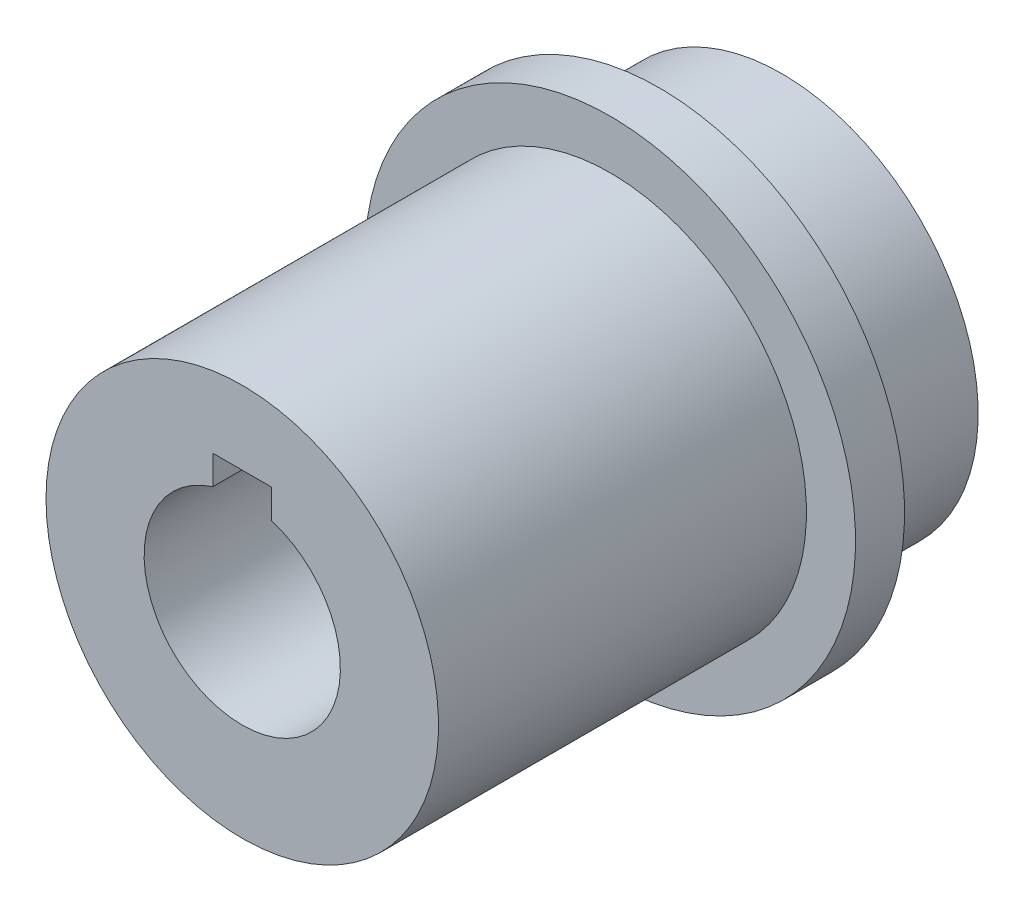
ISO-10303-21;
HEADER;
FILE_DESCRIPTION(('STEP AP214'),'2;1');
FILE_NAME('part.step','',(''),(''),'','','');
FILE_SCHEMA(('AUTOMOTIVE_DESIGN { 1 0 10303 214 1 1 1 1 }'));
ENDSEC;
DATA;
#1=APPLICATION_CONTEXT('core data for automotive mechanical design processes');
#2=APPLICATION_PROTOCOL_DEFINITION('international standard','automotive_design',2000,#1);
#3=PRODUCT_CONTEXT('',#1,'mechanical');
#4=PRODUCT('Part','Part','',(#3));
#5=PRODUCT_RELATED_PRODUCT_CATEGORY('part','',(#4));
#6=PRODUCT_DEFINITION_FORMATION('','',#4);
#7=PRODUCT_DEFINITION_CONTEXT('part definition',#1,'design');
#8=PRODUCT_DEFINITION('design','',#6,#7);
#9=PRODUCT_DEFINITION_SHAPE('','',#8);
#10=(LENGTH_UNIT() NAMED_UNIT(*) SI_UNIT(.MILLI.,.METRE.));
#11=(NAMED_UNIT(*) PLANE_ANGLE_UNIT() SI_UNIT($,.RADIAN.));
#12=(NAMED_UNIT(*) SI_UNIT($,.STERADIAN.) SOLID_ANGLE_UNIT());
#13=UNCERTAINTY_MEASURE_WITH_UNIT(LENGTH_MEASURE(1.E-05),#10,'distance_accuracy_value','');
#14=(GEOMETRIC_REPRESENTATION_CONTEXT(3) GLOBAL_UNCERTAINTY_ASSIGNED_CONTEXT((#13)) GLOBAL_UNIT_ASSIGNED_CONTEXT((#10,
#11,#12)) REPRESENTATION_CONTEXT('',''));
#15=CARTESIAN_POINT('',(0.,0.,0.));
#16=DIRECTION('',(0.,0.,1.));
#17=DIRECTION('',(1.,0.,0.));
#18=AXIS2_PLACEMENT_3D('',#15,#16,#17);
#19=CARTESIAN_POINT('',(0.,0.,109.999999999999));
#20=DIRECTION('',(0.,0.,-0.999999999999995));
#21=DIRECTION('',(-0.999999999999999,0.,0.));
#22=AXIS2_PLACEMENT_3D('',#19,#20,#21);
#23=CYLINDRICAL_SURFACE('',#22,40.);
#24=CARTESIAN_POINT('',(0.,0.,0.));
#25=DIRECTION('',(0.,0.,0.999999999999995));
#26=DIRECTION('',(0.999999999999999,0.,0.));
#27=AXIS2_PLACEMENT_3D('',#24,#25,#26);
#28=CIRCLE('',#27,40.);
#29=CARTESIAN_POINT('',(-40.,0.,0.));
#30=VERTEX_POINT('',#29);
#31=EDGE_CURVE('E117',#30,#30,#28,.T.);
#32=CARTESIAN_POINT('',(0.,0.,24.9999999999998));
#33=DIRECTION('',(0.,0.,0.999999999999995));
#34=DIRECTION('',(0.999999999999999,0.,0.));
#35=AXIS2_PLACEMENT_3D('',#32,#33,#34);
#36=CIRCLE('',#35,40.);
#37=CARTESIAN_POINT('',(-40.,0.,24.9999999999998));
#38=VERTEX_POINT('',#37);
#39=EDGE_CURVE('E109',#38,#38,#36,.T.);
#40=CARTESIAN_POINT('',(-40.,0.,0.));
#41=CARTESIAN_POINT('',(-40.,0.,0.260416666666652));
#42=CARTESIAN_POINT('',(-40.,0.,0.520833333333318));
#43=CARTESIAN_POINT('',(-40.,0.,1.04166666666665));
#44=CARTESIAN_POINT('',(-40.,0.,1.30208333333331));
#45=CARTESIAN_POINT('',(-40.,0.,1.82291666666664));
#46=CARTESIAN_POINT('',(-40.,0.,2.0833333333333));
#47=CARTESIAN_POINT('',(-40.,0.,2.60416666666663));
#48=CARTESIAN_POINT('',(-40.,0.,2.8645833333333));
#49=CARTESIAN_POINT('',(-40.,0.,3.38541666666663));
#50=CARTESIAN_POINT('',(-40.,0.,3.6458333333333));
#51=CARTESIAN_POINT('',(-40.,0.,4.16666666666663));
#52=CARTESIAN_POINT('',(-40.,0.,4.42708333333329));
#53=CARTESIAN_POINT('',(-40.,0.,4.94791666666662));
#54=CARTESIAN_POINT('',(-40.,0.,5.20833333333329));
#55=CARTESIAN_POINT('',(-40.,0.,5.72916666666662));
#56=CARTESIAN_POINT('',(-40.,0.,5.98958333333328));
#57=CARTESIAN_POINT('',(-40.,0.,6.51041666666662));
#58=CARTESIAN_POINT('',(-40.,0.,6.77083333333328));
#59=CARTESIAN_POINT('',(-40.,0.,7.29166666666661));
#60=CARTESIAN_POINT('',(-40.,0.,7.55208333333327));
#61=CARTESIAN_POINT('',(-40.,0.,8.0729166666666));
#62=CARTESIAN_POINT('',(-40.,0.,8.33333333333326));
#63=CARTESIAN_POINT('',(-40.,0.,8.8541666666666));
#64=CARTESIAN_POINT('',(-40.,0.,9.11458333333327));
#65=CARTESIAN_POINT('',(-40.,0.,9.6354166666666));
#66=CARTESIAN_POINT('',(-40.,0.,9.89583333333326));
#67=CARTESIAN_POINT('',(-40.,0.,10.4166666666666));
#68=CARTESIAN_POINT('',(-40.,0.,10.6770833333333));
#69=CARTESIAN_POINT('',(-40.,0.,11.1979166666666));
#70=CARTESIAN_POINT('',(-40.,0.,11.4583333333333));
#71=CARTESIAN_POINT('',(-40.,0.,11.9791666666666));
#72=CARTESIAN_POINT('',(-40.,0.,12.2395833333332));
#73=CARTESIAN_POINT('',(-40.,0.,12.7604166666666));
#74=CARTESIAN_POINT('',(-40.,0.,13.0208333333332));
#75=CARTESIAN_POINT('',(-40.,0.,13.5416666666666));
#76=CARTESIAN_POINT('',(-40.,0.,13.8020833333332));
#77=CARTESIAN_POINT('',(-40.,0.,14.3229166666666));
#78=CARTESIAN_POINT('',(-40.,0.,14.5833333333332));
#79=CARTESIAN_POINT('',(-40.,0.,15.1041666666666));
#80=CARTESIAN_POINT('',(-40.,0.,15.3645833333332));
#81=CARTESIAN_POINT('',(-40.,0.,15.8854166666665));
#82=CARTESIAN_POINT('',(-40.,0.,16.1458333333332));
#83=CARTESIAN_POINT('',(-40.,0.,16.6666666666666));
#84=CARTESIAN_POINT('',(-40.,0.,16.9270833333332));
#85=CARTESIAN_POINT('',(-40.,0.,17.4479166666665));
#86=CARTESIAN_POINT('',(-40.,0.,17.7083333333332));
#87=CARTESIAN_POINT('',(-40.,0.,18.2291666666665));
#88=CARTESIAN_POINT('',(-40.,0.,18.4895833333332));
#89=CARTESIAN_POINT('',(-40.,0.,19.0104166666665));
#90=CARTESIAN_POINT('',(-40.,0.,19.2708333333332));
#91=CARTESIAN_POINT('',(-40.,0.,19.7916666666665));
#92=CARTESIAN_POINT('',(-40.,0.,20.0520833333332));
#93=CARTESIAN_POINT('',(-40.,0.,20.5729166666665));
#94=CARTESIAN_POINT('',(-40.,0.,20.8333333333332));
#95=CARTESIAN_POINT('',(-40.,0.,21.3541666666665));
#96=CARTESIAN_POINT('',(-40.,0.,21.6145833333332));
#97=CARTESIAN_POINT('',(-40.,0.,22.1354166666665));
#98=CARTESIAN_POINT('',(-40.,0.,22.3958333333332));
#99=CARTESIAN_POINT('',(-40.,0.,22.9166666666665));
#100=CARTESIAN_POINT('',(-40.,0.,23.1770833333332));
#101=CARTESIAN_POINT('',(-40.,0.,23.6979166666665));
#102=CARTESIAN_POINT('',(-40.,0.,23.9583333333332));
#103=CARTESIAN_POINT('',(-40.,0.,24.4791666666665));
#104=CARTESIAN_POINT('',(-40.,0.,24.7395833333332));
#105=CARTESIAN_POINT('',(-40.,0.,24.9999999999998));
#106=B_SPLINE_CURVE_WITH_KNOTS('',3,(#40,#41,#42,#43,#44,#45,#46,#47,#48,#49,#50,#51,#52,#53,
#54,#55,#56,#57,#58,#59,#60,#61,#62,#63,#64,#65,#66,#67,#68,#69,#70,#71,#72,#73,#74,#75,#76,#77,
#78,#79,#80,#81,#82,#83,#84,#85,#86,#87,#88,#89,#90,#91,#92,#93,#94,#95,#96,#97,#98,#99,#100,
#101,#102,#103,#104,#105),.UNSPECIFIED.,.F.,.F.,(4,2,2,2,2,2,2,2,2,2,2,2,2,2,2,2,2,2,2,2,2,2,2,
2,2,2,2,2,2,2,2,2,4),(0.,0.781249999999997,1.56249999999999,2.34374999999998,3.12499999999998,
3.90624999999999,4.68749999999997,5.46874999999997,6.24999999999996,7.03124999999996,
7.81249999999994,8.59374999999994,9.37499999999995,10.1562499999999,10.9374999999999,
11.7187499999999,12.4999999999999,13.2812499999999,14.0624999999999,14.8437499999999,
15.6249999999999,16.4062499999999,17.1874999999999,17.9687499999999,18.7499999999999,
19.5312499999999,20.3124999999999,21.0937499999999,21.8749999999999,22.6562499999999,
23.4374999999998,24.2187499999998,24.9999999999998),.UNSPECIFIED.);
#107=EDGE_CURVE('BSEAM34',#30,#38,#106,.T.);
#108=ORIENTED_EDGE('',*,*,#31,.T.);
#109=ORIENTED_EDGE('',*,*,#39,.F.);
#110=ORIENTED_EDGE('',*,*,#107,.T.);
#111=ORIENTED_EDGE('',*,*,#107,.F.);
#112=EDGE_LOOP('',(#108,#110,#109,#111));
#113=FACE_BOUND('',#112,.T.);
#114=ADVANCED_FACE('F34',(#113),#23,.T.);
#115=CARTESIAN_POINT('',(0.,0.,109.999999999999));
#116=DIRECTION('',(0.,0.,0.999999999999995));
#117=DIRECTION('',(0.999999999999999,0.,0.));
#118=AXIS2_PLACEMENT_3D('',#115,#116,#117);
#119=PLANE('',#118);
#120=DIRECTION('',(0.,-0.999999999999999,0.));
#121=VECTOR('',#120,1.);
#122=CARTESIAN_POINT('',(6.00000000000001,24.9999999999999,109.999999999999));
#123=LINE('',#122,#121);
#124=CARTESIAN_POINT('',(6.00000000000001,24.9999999999999,109.999999999999));
#125=VERTEX_POINT('',#124);
#126=CARTESIAN_POINT('',(6.00000000000001,19.0787840283391,109.999999999999));
#127=VERTEX_POINT('',#126);
#128=EDGE_CURVE('E92',#125,#127,#123,.T.);
#129=ORIENTED_EDGE('',*,*,#128,.T.);
#130=CARTESIAN_POINT('',(0.,0.,109.999999999999));
#131=DIRECTION('',(0.,0.,0.999999999999995));
#132=DIRECTION('',(0.999999999999999,0.,0.));
#133=AXIS2_PLACEMENT_3D('',#130,#131,#132);
#134=CIRCLE('',#133,20.);
#135=CARTESIAN_POINT('',(-5.99999999999978,19.0787840283393,109.999999999999));
#136=VERTEX_POINT('',#135);
#137=EDGE_CURVE('E91',#136,#127,#134,.T.);
#138=ORIENTED_EDGE('',*,*,#137,.F.);
#139=DIRECTION('',(0.,0.999999999999997,0.));
#140=VECTOR('',#139,1.);
#141=CARTESIAN_POINT('',(-5.99999999999984,24.9999999999997,109.999999999999));
#142=LINE('',#141,#140);
#143=CARTESIAN_POINT('',(-5.99999999999984,24.9999999999997,109.999999999999));
#144=VERTEX_POINT('',#143);
#145=EDGE_CURVE('E49',#136,#144,#142,.T.);
#146=ORIENTED_EDGE('',*,*,#145,.T.);
#147=DIRECTION('',(0.999999999999999,0.,0.));
#148=VECTOR('',#147,1.);
#149=CARTESIAN_POINT('',(6.00000000000001,24.9999999999999,109.999999999999));
#150=LINE('',#149,#148);
#151=EDGE_CURVE('E81',#144,#125,#150,.T.);
#152=ORIENTED_EDGE('',*,*,#151,.T.);
#153=EDGE_LOOP('',(#129,#138,#146,#152));
#154=FACE_BOUND('',#153,.T.);
#155=CARTESIAN_POINT('',(0.,0.,109.999999999999));
#156=DIRECTION('',(0.,0.,0.999999999999995));
#157=DIRECTION('',(0.999999999999999,0.,0.));
#158=AXIS2_PLACEMENT_3D('',#155,#156,#157);
#159=CIRCLE('',#158,40.);
#160=CARTESIAN_POINT('',(-40.,0.,109.999999999999));
#161=VERTEX_POINT('',#160);
#162=EDGE_CURVE('E112',#161,#161,#159,.T.);
#163=ORIENTED_EDGE('',*,*,#162,.T.);
#164=EDGE_LOOP('',(#163));
#165=FACE_BOUND('',#164,.T.);
#166=ADVANCED_FACE('F88',(#154,#165),#119,.T.);
#167=CARTESIAN_POINT('',(0.,0.,0.));
#168=DIRECTION('',(0.,0.,0.999999999999995));
#169=DIRECTION('',(0.999999999999999,0.,0.));
#170=AXIS2_PLACEMENT_3D('',#167,#168,#169);
#171=PLANE('',#170);
#172=ORIENTED_EDGE('',*,*,#31,.F.);
#173=EDGE_LOOP('',(#172));
#174=FACE_BOUND('',#173,.T.);
#175=CARTESIAN_POINT('',(0.,0.,0.));
#176=DIRECTION('',(0.,0.,0.999999999999995));
#177=DIRECTION('',(0.999999999999999,0.,0.));
#178=AXIS2_PLACEMENT_3D('',#175,#176,#177);
#179=CIRCLE('',#178,20.);
#180=CARTESIAN_POINT('',(-5.99999999999978,19.0787840283393,0.));
#181=VERTEX_POINT('',#180);
#182=CARTESIAN_POINT('',(6.00000000000001,19.0787840283391,0.));
#183=VERTEX_POINT('',#182);
#184=EDGE_CURVE('E115',#181,#183,#179,.T.);
#185=ORIENTED_EDGE('',*,*,#184,.T.);
#186=DIRECTION('',(0.,-0.999999999999999,0.));
#187=VECTOR('',#186,1.);
#188=CARTESIAN_POINT('',(6.00000000000001,24.9999999999999,0.));
#189=LINE('',#188,#187);
#190=CARTESIAN_POINT('',(6.00000000000001,24.9999999999999,0.));
#191=VERTEX_POINT('',#190);
#192=EDGE_CURVE('E97',#191,#183,#189,.T.);
#193=ORIENTED_EDGE('',*,*,#192,.F.);
#194=DIRECTION('',(0.999999999999999,0.,0.));
#195=VECTOR('',#194,1.);
#196=CARTESIAN_POINT('',(6.00000000000001,24.9999999999999,0.));
#197=LINE('',#196,#195);
#198=CARTESIAN_POINT('',(-5.99999999999984,24.9999999999997,0.));
#199=VERTEX_POINT('',#198);
#200=EDGE_CURVE('E94',#199,#191,#197,.T.);
#201=ORIENTED_EDGE('',*,*,#200,.F.);
#202=DIRECTION('',(0.,0.999999999999997,0.));
#203=VECTOR('',#202,1.);
#204=CARTESIAN_POINT('',(-5.99999999999984,24.9999999999997,0.));
#205=LINE('',#204,#203);
#206=EDGE_CURVE('E76',#181,#199,#205,.T.);
#207=ORIENTED_EDGE('',*,*,#206,.F.);
#208=EDGE_LOOP('',(#185,#193,#201,#207));
#209=FACE_BOUND('',#208,.T.);
#210=ADVANCED_FACE('F126',(#174,#209),#171,.F.);
#211=CARTESIAN_POINT('',(0.,0.,34.9999999999997));
#212=DIRECTION('',(0.,0.,0.999999999999995));
#213=DIRECTION('',(0.999999999999999,0.,0.));
#214=AXIS2_PLACEMENT_3D('',#211,#212,#213);
#215=CIRCLE('',#214,40.);
#216=CARTESIAN_POINT('',(-40.,0.,34.9999999999997));
#217=VERTEX_POINT('',#216);
#218=EDGE_CURVE('E106',#217,#217,#215,.T.);
#219=CARTESIAN_POINT('',(-40.,0.,34.9999999999997));
#220=CARTESIAN_POINT('',(-40.,0.,35.7812499999997));
#221=CARTESIAN_POINT('',(-40.,0.,36.5624999999997));
#222=CARTESIAN_POINT('',(-40.,0.,38.1249999999997));
#223=CARTESIAN_POINT('',(-40.,0.,38.9062499999997));
#224=CARTESIAN_POINT('',(-40.,0.,40.4687499999996));
#225=CARTESIAN_POINT('',(-40.,0.,41.2499999999996));
#226=CARTESIAN_POINT('',(-40.,0.,42.8124999999996));
#227=CARTESIAN_POINT('',(-40.,0.,43.5937499999996));
#228=CARTESIAN_POINT('',(-40.,0.,45.1562499999996));
#229=CARTESIAN_POINT('',(-40.,0.,45.9374999999996));
#230=CARTESIAN_POINT('',(-40.,0.,47.4999999999996));
#231=CARTESIAN_POINT('',(-40.,0.,48.2812499999996));
#232=CARTESIAN_POINT('',(-40.,0.,49.8437499999996));
#233=CARTESIAN_POINT('',(-40.,0.,50.6249999999996));
#234=CARTESIAN_POINT('',(-40.,0.,52.1874999999996));
#235=CARTESIAN_POINT('',(-40.,0.,52.9687499999996));
#236=CARTESIAN_POINT('',(-40.,0.,54.5312499999996));
#237=CARTESIAN_POINT('',(-40.,0.,55.3124999999996));
#238=CARTESIAN_POINT('',(-40.,0.,56.8749999999996));
#239=CARTESIAN_POINT('',(-40.,0.,57.6562499999996));
#240=CARTESIAN_POINT('',(-40.,0.,59.2187499999996));
#241=CARTESIAN_POINT('',(-40.,0.,59.9999999999996));
#242=CARTESIAN_POINT('',(-40.,0.,61.5624999999995));
#243=CARTESIAN_POINT('',(-40.,0.,62.3437499999995));
#244=CARTESIAN_POINT('',(-40.,0.,63.9062499999995));
#245=CARTESIAN_POINT('',(-40.,0.,64.6874999999995));
#246=CARTESIAN_POINT('',(-40.,0.,66.2499999999995));
#247=CARTESIAN_POINT('',(-40.,0.,67.0312499999995));
#248=CARTESIAN_POINT('',(-40.,0.,68.5937499999995));
#249=CARTESIAN_POINT('',(-40.,0.,69.3749999999995));
#250=CARTESIAN_POINT('',(-40.,0.,70.9374999999995));
#251=CARTESIAN_POINT('',(-40.,0.,71.7187499999995));
#252=CARTESIAN_POINT('',(-40.,0.,73.2812499999995));
#253=CARTESIAN_POINT('',(-40.,0.,74.0624999999995));
#254=CARTESIAN_POINT('',(-40.,0.,75.6249999999995));
#255=CARTESIAN_POINT('',(-40.,0.,76.4062499999995));
#256=CARTESIAN_POINT('',(-40.,0.,77.9687499999995));
#257=CARTESIAN_POINT('',(-40.,0.,78.7499999999995));
#258=CARTESIAN_POINT('',(-40.,0.,80.3124999999995));
#259=CARTESIAN_POINT('',(-40.,0.,81.0937499999994));
#260=CARTESIAN_POINT('',(-40.,0.,82.6562499999994));
#261=CARTESIAN_POINT('',(-40.,0.,83.4374999999994));
#262=CARTESIAN_POINT('',(-40.,0.,84.9999999999994));
#263=CARTESIAN_POINT('',(-40.,0.,85.7812499999994));
#264=CARTESIAN_POINT('',(-40.,0.,87.3437499999994));
#265=CARTESIAN_POINT('',(-40.,0.,88.1249999999994));
#266=CARTESIAN_POINT('',(-40.,0.,89.6874999999994));
#267=CARTESIAN_POINT('',(-40.,0.,90.4687499999994));
#268=CARTESIAN_POINT('',(-40.,0.,92.0312499999994));
#269=CARTESIAN_POINT('',(-40.,0.,92.8124999999994));
#270=CARTESIAN_POINT('',(-40.,0.,94.3749999999994));
#271=CARTESIAN_POINT('',(-40.,0.,95.1562499999994));
#272=CARTESIAN_POINT('',(-40.,0.,96.7187499999994));
#273=CARTESIAN_POINT('',(-40.,0.,97.4999999999994));
#274=CARTESIAN_POINT('',(-40.,0.,99.0624999999994));
#275=CARTESIAN_POINT('',(-40.,0.,99.8437499999994));
#276=CARTESIAN_POINT('',(-40.,0.,101.406249999999));
#277=CARTESIAN_POINT('',(-40.,0.,102.187499999999));
#278=CARTESIAN_POINT('',(-40.,0.,103.749999999999));
#279=CARTESIAN_POINT('',(-40.,0.,104.531249999999));
#280=CARTESIAN_POINT('',(-40.,0.,106.093749999999));
#281=CARTESIAN_POINT('',(-40.,0.,106.874999999999));
#282=CARTESIAN_POINT('',(-40.,0.,108.437499999999));
#283=CARTESIAN_POINT('',(-40.,0.,109.218749999999));
#284=CARTESIAN_POINT('',(-40.,0.,109.999999999999));
#285=B_SPLINE_CURVE_WITH_KNOTS('',3,(#219,#220,#221,#222,#223,#224,#225,#226,#227,#228,#229,
#230,#231,#232,#233,#234,#235,#236,#237,#238,#239,#240,#241,#242,#243,#244,#245,#246,#247,#248,
#249,#250,#251,#252,#253,#254,#255,#256,#257,#258,#259,#260,#261,#262,#263,#264,#265,#266,#267,
#268,#269,#270,#271,#272,#273,#274,#275,#276,#277,#278,#279,#280,#281,#282,#283,#284),
.UNSPECIFIED.,.F.,.F.,(4,2,2,2,2,2,2,2,2,2,2,2,2,2,2,2,2,2,2,2,2,2,2,2,2,2,2,2,2,2,2,2,4),(0.,
2.34374999999999,4.68749999999997,7.03124999999996,9.37499999999995,11.7187499999999,
14.0624999999999,16.4062499999999,18.7499999999999,21.0937499999999,23.4374999999999,
25.7812499999999,28.1249999999999,30.4687499999999,32.8124999999998,35.1562499999998,
37.4999999999998,39.8437499999998,42.1874999999998,44.5312499999998,46.8749999999998,
49.2187499999998,51.5624999999998,53.9062499999997,56.2499999999997,58.5937499999997,
60.9374999999997,63.2812499999997,65.6249999999997,67.9687499999997,70.3124999999997,
72.6562499999997,74.9999999999996),.UNSPECIFIED.);
#286=EDGE_CURVE('BSEAM36',#217,#161,#285,.T.);
#287=ORIENTED_EDGE('',*,*,#218,.T.);
#288=ORIENTED_EDGE('',*,*,#162,.F.);
#289=ORIENTED_EDGE('',*,*,#286,.T.);
#290=ORIENTED_EDGE('',*,*,#286,.F.);
#291=EDGE_LOOP('',(#287,#289,#288,#290));
#292=FACE_BOUND('',#291,.T.);
#293=ADVANCED_FACE('F36',(#292),#23,.T.);
#294=CARTESIAN_POINT('',(0.,0.,109.999999999999));
#295=DIRECTION('',(0.,0.,-0.999999999999995));
#296=DIRECTION('',(-0.999999999999999,0.,0.));
#297=AXIS2_PLACEMENT_3D('',#294,#295,#296);
#298=CYLINDRICAL_SURFACE('',#297,20.);
#299=DIRECTION('',(0.,0.,-0.999999999999995));
#300=VECTOR('',#299,1.);
#301=CARTESIAN_POINT('',(6.00000000000001,19.0787840283391,109.999999999999));
#302=LINE('',#301,#300);
#303=EDGE_CURVE('E11',#183,#127,#302,.F.);
#304=ORIENTED_EDGE('',*,*,#303,.F.);
#305=ORIENTED_EDGE('',*,*,#184,.F.);
#306=DIRECTION('',(0.,0.,-0.999999999999995));
#307=VECTOR('',#306,1.);
#308=CARTESIAN_POINT('',(-5.99999999999978,19.0787840283393,109.999999999999));
#309=LINE('',#308,#307);
#310=EDGE_CURVE('E42',#136,#181,#309,.T.);
#311=ORIENTED_EDGE('',*,*,#310,.F.);
#312=ORIENTED_EDGE('',*,*,#137,.T.);
#313=EDGE_LOOP('',(#304,#305,#311,#312));
#314=FACE_BOUND('',#313,.T.);
#315=ADVANCED_FACE('F128',(#314),#298,.F.);
#316=CARTESIAN_POINT('',(0.,0.,34.9999999999997));
#317=DIRECTION('',(0.,0.,0.999999999999995));
#318=DIRECTION('',(0.999999999999999,0.,0.));
#319=AXIS2_PLACEMENT_3D('',#316,#317,#318);
#320=PLANE('',#319);
#321=CARTESIAN_POINT('',(0.,0.,34.9999999999997));
#322=DIRECTION('',(0.,0.,0.999999999999995));
#323=DIRECTION('',(0.999999999999999,0.,0.));
#324=AXIS2_PLACEMENT_3D('',#321,#322,#323);
#325=CIRCLE('',#324,50.);
#326=CARTESIAN_POINT('',(-49.9999999999999,0.,34.9999999999997));
#327=VERTEX_POINT('',#326);
#328=EDGE_CURVE('E103',#327,#327,#325,.T.);
#329=ORIENTED_EDGE('',*,*,#328,.T.);
#330=EDGE_LOOP('',(#329));
#331=FACE_BOUND('',#330,.T.);
#332=ORIENTED_EDGE('',*,*,#218,.F.);
#333=EDGE_LOOP('',(#332));
#334=FACE_BOUND('',#333,.T.);
#335=ADVANCED_FACE('F130',(#331,#334),#320,.T.);
#336=CARTESIAN_POINT('',(0.,0.,24.9999999999998));
#337=DIRECTION('',(0.,0.,0.999999999999995));
#338=DIRECTION('',(0.999999999999999,0.,0.));
#339=AXIS2_PLACEMENT_3D('',#336,#337,#338);
#340=PLANE('',#339);
#341=CARTESIAN_POINT('',(0.,0.,24.9999999999998));
#342=DIRECTION('',(0.,0.,0.999999999999995));
#343=DIRECTION('',(0.999999999999999,0.,0.));
#344=AXIS2_PLACEMENT_3D('',#341,#342,#343);
#345=CIRCLE('',#344,50.);
#346=CARTESIAN_POINT('',(-49.9999999999999,0.,24.9999999999998));
#347=VERTEX_POINT('',#346);
#348=EDGE_CURVE('E101',#347,#347,#345,.T.);
#349=ORIENTED_EDGE('',*,*,#348,.F.);
#350=EDGE_LOOP('',(#349));
#351=FACE_BOUND('',#350,.T.);
#352=ORIENTED_EDGE('',*,*,#39,.T.);
#353=EDGE_LOOP('',(#352));
#354=FACE_BOUND('',#353,.T.);
#355=ADVANCED_FACE('F136',(#351,#354),#340,.F.);
#356=CARTESIAN_POINT('',(0.,0.,34.9999999999997));
#357=DIRECTION('',(0.,0.,-0.999999999999995));
#358=DIRECTION('',(-0.999999999999999,0.,0.));
#359=AXIS2_PLACEMENT_3D('',#356,#357,#358);
#360=CYLINDRICAL_SURFACE('',#359,50.);
#361=CARTESIAN_POINT('',(-49.9999999999999,0.,34.9999999999997));
#362=CARTESIAN_POINT('',(-49.9999999999999,0.,34.895833333333));
#363=CARTESIAN_POINT('',(-49.9999999999999,0.,34.7916666666663));
#364=CARTESIAN_POINT('',(-49.9999999999999,0.,34.583333333333));
#365=CARTESIAN_POINT('',(-49.9999999999999,0.,34.4791666666663));
#366=CARTESIAN_POINT('',(-49.9999999999999,0.,34.270833333333));
#367=CARTESIAN_POINT('',(-49.9999999999999,0.,34.1666666666663));
#368=CARTESIAN_POINT('',(-49.9999999999999,0.,33.958333333333));
#369=CARTESIAN_POINT('',(-49.9999999999999,0.,33.8541666666664));
#370=CARTESIAN_POINT('',(-49.9999999999999,0.,33.645833333333));
#371=CARTESIAN_POINT('',(-49.9999999999999,0.,33.5416666666664));
#372=CARTESIAN_POINT('',(-49.9999999999999,0.,33.333333333333));
#373=CARTESIAN_POINT('',(-49.9999999999999,0.,33.2291666666664));
#374=CARTESIAN_POINT('',(-49.9999999999999,0.,33.020833333333));
#375=CARTESIAN_POINT('',(-49.9999999999999,0.,32.9166666666664));
#376=CARTESIAN_POINT('',(-49.9999999999999,0.,32.708333333333));
#377=CARTESIAN_POINT('',(-49.9999999999999,0.,32.6041666666664));
#378=CARTESIAN_POINT('',(-49.9999999999999,0.,32.395833333333));
#379=CARTESIAN_POINT('',(-49.9999999999999,0.,32.2916666666664));
#380=CARTESIAN_POINT('',(-49.9999999999999,0.,32.083333333333));
#381=CARTESIAN_POINT('',(-49.9999999999999,0.,31.9791666666664));
#382=CARTESIAN_POINT('',(-49.9999999999999,0.,31.7708333333331));
#383=CARTESIAN_POINT('',(-49.9999999999999,0.,31.6666666666664));
#384=CARTESIAN_POINT('',(-49.9999999999999,0.,31.4583333333331));
#385=CARTESIAN_POINT('',(-49.9999999999999,0.,31.3541666666664));
#386=CARTESIAN_POINT('',(-49.9999999999999,0.,31.1458333333331));
#387=CARTESIAN_POINT('',(-49.9999999999999,0.,31.0416666666664));
#388=CARTESIAN_POINT('',(-49.9999999999999,0.,30.8333333333331));
#389=CARTESIAN_POINT('',(-49.9999999999999,0.,30.7291666666664));
#390=CARTESIAN_POINT('',(-49.9999999999999,0.,30.5208333333331));
#391=CARTESIAN_POINT('',(-49.9999999999999,0.,30.4166666666664));
#392=CARTESIAN_POINT('',(-49.9999999999999,0.,30.2083333333331));
#393=CARTESIAN_POINT('',(-49.9999999999999,0.,30.1041666666664));
#394=CARTESIAN_POINT('',(-49.9999999999999,0.,29.8958333333331));
#395=CARTESIAN_POINT('',(-49.9999999999999,0.,29.7916666666664));
#396=CARTESIAN_POINT('',(-49.9999999999999,0.,29.5833333333331));
#397=CARTESIAN_POINT('',(-49.9999999999999,0.,29.4791666666664));
#398=CARTESIAN_POINT('',(-49.9999999999999,0.,29.2708333333331));
#399=CARTESIAN_POINT('',(-49.9999999999999,0.,29.1666666666664));
#400=CARTESIAN_POINT('',(-49.9999999999999,0.,28.9583333333331));
#401=CARTESIAN_POINT('',(-49.9999999999999,0.,28.8541666666664));
#402=CARTESIAN_POINT('',(-49.9999999999999,0.,28.6458333333331));
#403=CARTESIAN_POINT('',(-49.9999999999999,0.,28.5416666666664));
#404=CARTESIAN_POINT('',(-49.9999999999999,0.,28.3333333333331));
#405=CARTESIAN_POINT('',(-49.9999999999999,0.,28.2291666666664));
#406=CARTESIAN_POINT('',(-49.9999999999999,0.,28.0208333333331));
#407=CARTESIAN_POINT('',(-49.9999999999999,0.,27.9166666666665));
#408=CARTESIAN_POINT('',(-49.9999999999999,0.,27.7083333333331));
#409=CARTESIAN_POINT('',(-49.9999999999999,0.,27.6041666666665));
#410=CARTESIAN_POINT('',(-49.9999999999999,0.,27.3958333333331));
#411=CARTESIAN_POINT('',(-49.9999999999999,0.,27.2916666666665));
#412=CARTESIAN_POINT('',(-49.9999999999999,0.,27.0833333333331));
#413=CARTESIAN_POINT('',(-49.9999999999999,0.,26.9791666666665));
#414=CARTESIAN_POINT('',(-49.9999999999999,0.,26.7708333333331));
#415=CARTESIAN_POINT('',(-49.9999999999999,0.,26.6666666666665));
#416=CARTESIAN_POINT('',(-49.9999999999999,0.,26.4583333333331));
#417=CARTESIAN_POINT('',(-49.9999999999999,0.,26.3541666666665));
#418=CARTESIAN_POINT('',(-49.9999999999999,0.,26.1458333333331));
#419=CARTESIAN_POINT('',(-49.9999999999999,0.,26.0416666666665));
#420=CARTESIAN_POINT('',(-49.9999999999999,0.,25.8333333333332));
#421=CARTESIAN_POINT('',(-49.9999999999999,0.,25.7291666666665));
#422=CARTESIAN_POINT('',(-49.9999999999999,0.,25.5208333333332));
#423=CARTESIAN_POINT('',(-49.9999999999999,0.,25.4166666666665));
#424=CARTESIAN_POINT('',(-49.9999999999999,0.,25.2083333333332));
#425=CARTESIAN_POINT('',(-49.9999999999999,0.,25.1041666666665));
#426=CARTESIAN_POINT('',(-49.9999999999999,0.,24.9999999999998));
#427=B_SPLINE_CURVE_WITH_KNOTS('',3,(#361,#362,#363,#364,#365,#366,#367,#368,#369,#370,#371,
#372,#373,#374,#375,#376,#377,#378,#379,#380,#381,#382,#383,#384,#385,#386,#387,#388,#389,#390,
#391,#392,#393,#394,#395,#396,#397,#398,#399,#400,#401,#402,#403,#404,#405,#406,#407,#408,#409,
#410,#411,#412,#413,#414,#415,#416,#417,#418,#419,#420,#421,#422,#423,#424,#425,#426),
.UNSPECIFIED.,.F.,.F.,(4,2,2,2,2,2,2,2,2,2,2,2,2,2,2,2,2,2,2,2,2,2,2,2,2,2,2,2,2,2,2,2,4),(0.,
0.3125,0.624999999999994,0.937499999999987,1.24999999999998,1.56249999999998,1.87499999999997,
2.18749999999997,2.49999999999996,2.81249999999995,3.12499999999995,3.43749999999995,
3.74999999999994,4.06249999999993,4.37499999999993,4.68749999999992,4.99999999999992,
5.31249999999991,5.62499999999991,5.9374999999999,6.2499999999999,6.5624999999999,
6.87499999999989,7.18749999999988,7.49999999999988,7.81249999999987,8.12499999999987,
8.43749999999986,8.74999999999986,9.06249999999986,9.37499999999985,9.68749999999984,
9.99999999999983),.UNSPECIFIED.);
#428=EDGE_CURVE('BSEAM152',#327,#347,#427,.T.);
#429=ORIENTED_EDGE('',*,*,#328,.F.);
#430=ORIENTED_EDGE('',*,*,#348,.T.);
#431=ORIENTED_EDGE('',*,*,#428,.T.);
#432=ORIENTED_EDGE('',*,*,#428,.F.);
#433=EDGE_LOOP('',(#429,#431,#430,#432));
#434=FACE_BOUND('',#433,.T.);
#435=ADVANCED_FACE('F152',(#434),#360,.T.);
#436=CARTESIAN_POINT('',(6.00000000000001,24.9999999999999,109.999999999999));
#437=DIRECTION('',(0.999999999999999,0.,0.));
#438=DIRECTION('',(0.,0.999999999999999,0.));
#439=AXIS2_PLACEMENT_3D('',#436,#437,#438);
#440=PLANE('',#439);
#441=ORIENTED_EDGE('',*,*,#303,.T.);
#442=ORIENTED_EDGE('',*,*,#128,.F.);
#443=DIRECTION('',(0.,0.,-0.999999999999995));
#444=VECTOR('',#443,1.);
#445=CARTESIAN_POINT('',(6.00000000000001,24.9999999999999,109.999999999999));
#446=LINE('',#445,#444);
#447=EDGE_CURVE('E80',#125,#191,#446,.T.);
#448=ORIENTED_EDGE('',*,*,#447,.T.);
#449=ORIENTED_EDGE('',*,*,#192,.T.);
#450=EDGE_LOOP('',(#441,#442,#448,#449));
#451=FACE_BOUND('',#450,.T.);
#452=ADVANCED_FACE('F158',(#451),#440,.F.);
#453=CARTESIAN_POINT('',(6.00000000000001,24.9999999999999,109.999999999999));
#454=DIRECTION('',(0.,0.999999999999999,0.));
#455=DIRECTION('',(0.,0.,0.999999999999995));
#456=AXIS2_PLACEMENT_3D('',#453,#454,#455);
#457=PLANE('',#456);
#458=ORIENTED_EDGE('',*,*,#200,.T.);
#459=ORIENTED_EDGE('',*,*,#447,.F.);
#460=ORIENTED_EDGE('',*,*,#151,.F.);
#461=DIRECTION('',(0.,0.,-0.999999999999995));
#462=VECTOR('',#461,1.);
#463=CARTESIAN_POINT('',(-5.99999999999984,24.9999999999997,109.999999999999));
#464=LINE('',#463,#462);
#465=EDGE_CURVE('E72',#144,#199,#464,.T.);
#466=ORIENTED_EDGE('',*,*,#465,.T.);
#467=EDGE_LOOP('',(#458,#459,#460,#466));
#468=FACE_BOUND('',#467,.T.);
#469=ADVANCED_FACE('F84',(#468),#457,.F.);
#470=CARTESIAN_POINT('',(-5.99999999999984,24.9999999999997,109.999999999999));
#471=DIRECTION('',(-0.999999999999997,0.,0.));
#472=DIRECTION('',(0.,-0.999999999999997,0.));
#473=AXIS2_PLACEMENT_3D('',#470,#471,#472);
#474=PLANE('',#473);
#475=ORIENTED_EDGE('',*,*,#310,.T.);
#476=ORIENTED_EDGE('',*,*,#206,.T.);
#477=ORIENTED_EDGE('',*,*,#465,.F.);
#478=ORIENTED_EDGE('',*,*,#145,.F.);
#479=EDGE_LOOP('',(#475,#476,#477,#478));
#480=FACE_BOUND('',#479,.T.);
#481=ADVANCED_FACE('F74',(#480),#474,.F.);
#482=CLOSED_SHELL('',(#114,#166,#210,#293,#315,#335,#355,#435,#452,#469,#481));
#483=MANIFOLD_SOLID_BREP('B2',#482);
#484=ADVANCED_BREP_SHAPE_REPRESENTATION('',(#18,#483),#14);
#485=SHAPE_DEFINITION_REPRESENTATION(#9,#484);
ENDSEC;
END-ISO-10303-21;
